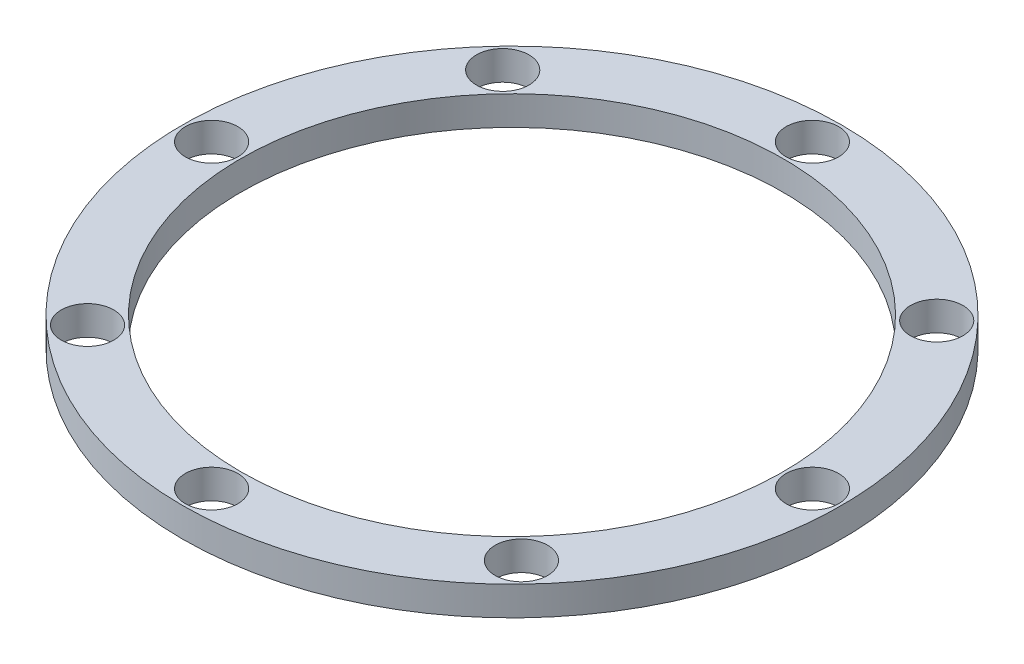
ISO-10303-21;
HEADER;
FILE_DESCRIPTION(('STEP AP214'),'2;1');
FILE_NAME('part.step','',(''),(''),'','','');
FILE_SCHEMA(('AUTOMOTIVE_DESIGN { 1 0 10303 214 1 1 1 1 }'));
ENDSEC;
DATA;
#1=APPLICATION_CONTEXT('core data for automotive mechanical design processes');
#2=APPLICATION_PROTOCOL_DEFINITION('international standard','automotive_design',2000,#1);
#3=PRODUCT_CONTEXT('',#1,'mechanical');
#4=PRODUCT('Part','Part','',(#3));
#5=PRODUCT_RELATED_PRODUCT_CATEGORY('part','',(#4));
#6=PRODUCT_DEFINITION_FORMATION('','',#4);
#7=PRODUCT_DEFINITION_CONTEXT('part definition',#1,'design');
#8=PRODUCT_DEFINITION('design','',#6,#7);
#9=PRODUCT_DEFINITION_SHAPE('','',#8);
#10=(LENGTH_UNIT() NAMED_UNIT(*) SI_UNIT(.MILLI.,.METRE.));
#11=(NAMED_UNIT(*) PLANE_ANGLE_UNIT() SI_UNIT($,.RADIAN.));
#12=(NAMED_UNIT(*) SI_UNIT($,.STERADIAN.) SOLID_ANGLE_UNIT());
#13=UNCERTAINTY_MEASURE_WITH_UNIT(LENGTH_MEASURE(1.E-05),#10,'distance_accuracy_value','');
#14=(GEOMETRIC_REPRESENTATION_CONTEXT(3) GLOBAL_UNCERTAINTY_ASSIGNED_CONTEXT((#13)) GLOBAL_UNIT_ASSIGNED_CONTEXT((#10,
#11,#12)) REPRESENTATION_CONTEXT('',''));
#15=CARTESIAN_POINT('',(0.,0.,0.));
#16=DIRECTION('',(0.,0.,1.));
#17=DIRECTION('',(1.,0.,0.));
#18=AXIS2_PLACEMENT_3D('',#15,#16,#17);
#19=CARTESIAN_POINT('',(0.,5.,51.5));
#20=DIRECTION('',(0.,-1.,0.));
#21=DIRECTION('',(0.,0.,-1.));
#22=AXIS2_PLACEMENT_3D('',#19,#20,#21);
#23=CYLINDRICAL_SURFACE('',#22,4.5);
#24=CARTESIAN_POINT('',(0.,5.,51.5));
#25=DIRECTION('',(0.,1.,0.));
#26=DIRECTION('',(0.,0.,1.));
#27=AXIS2_PLACEMENT_3D('',#24,#25,#26);
#28=CIRCLE('',#27,4.5);
#29=CARTESIAN_POINT('',(0.,5.,56.));
#30=VERTEX_POINT('',#29);
#31=EDGE_CURVE('E47',#30,#30,#28,.T.);
#32=ORIENTED_EDGE('',*,*,#31,.T.);
#33=EDGE_LOOP('',(#32));
#34=FACE_BOUND('',#33,.T.);
#35=CARTESIAN_POINT('',(0.,0.,51.5));
#36=DIRECTION('',(0.,1.,0.));
#37=DIRECTION('',(0.,0.,1.));
#38=AXIS2_PLACEMENT_3D('',#35,#36,#37);
#39=CIRCLE('',#38,4.5);
#40=CARTESIAN_POINT('',(0.,0.,56.));
#41=VERTEX_POINT('',#40);
#42=EDGE_CURVE('E79',#41,#41,#39,.T.);
#43=ORIENTED_EDGE('',*,*,#42,.F.);
#44=EDGE_LOOP('',(#43));
#45=FACE_BOUND('',#44,.T.);
#46=ADVANCED_FACE('F39',(#34,#45),#23,.F.);
#47=CARTESIAN_POINT('',(37.2149715697116,5.,35.5990995822304));
#48=DIRECTION('',(0.,-1.,0.));
#49=DIRECTION('',(0.,0.,-1.));
#50=AXIS2_PLACEMENT_3D('',#47,#48,#49);
#51=CYLINDRICAL_SURFACE('',#50,4.5);
#52=CARTESIAN_POINT('',(37.2149715697116,5.,35.5990995822304));
#53=DIRECTION('',(0.,1.,0.));
#54=DIRECTION('',(0.,0.,1.));
#55=AXIS2_PLACEMENT_3D('',#52,#53,#54);
#56=CIRCLE('',#55,4.5);
#57=CARTESIAN_POINT('',(37.2149715697116,5.,40.0990995822304));
#58=VERTEX_POINT('',#57);
#59=EDGE_CURVE('E52',#58,#58,#56,.T.);
#60=ORIENTED_EDGE('',*,*,#59,.T.);
#61=EDGE_LOOP('',(#60));
#62=FACE_BOUND('',#61,.T.);
#63=CARTESIAN_POINT('',(37.2149715697116,0.,35.5990995822304));
#64=DIRECTION('',(0.,1.,0.));
#65=DIRECTION('',(0.,0.,1.));
#66=AXIS2_PLACEMENT_3D('',#63,#64,#65);
#67=CIRCLE('',#66,4.5);
#68=CARTESIAN_POINT('',(37.2149715697116,0.,40.0990995822304));
#69=VERTEX_POINT('',#68);
#70=EDGE_CURVE('E77',#69,#69,#67,.T.);
#71=ORIENTED_EDGE('',*,*,#70,.F.);
#72=EDGE_LOOP('',(#71));
#73=FACE_BOUND('',#72,.T.);
#74=ADVANCED_FACE('F112',(#62,#73),#51,.F.);
#75=CARTESIAN_POINT('',(37.2149715697116,5.,-35.5990995822304));
#76=DIRECTION('',(0.,-1.,0.));
#77=DIRECTION('',(0.,0.,-1.));
#78=AXIS2_PLACEMENT_3D('',#75,#76,#77);
#79=CYLINDRICAL_SURFACE('',#78,4.50000000000001);
#80=CARTESIAN_POINT('',(37.2149715697116,5.,-35.5990995822304));
#81=DIRECTION('',(0.,1.,0.));
#82=DIRECTION('',(0.,0.,1.));
#83=AXIS2_PLACEMENT_3D('',#80,#81,#82);
#84=CIRCLE('',#83,4.50000000000001);
#85=CARTESIAN_POINT('',(37.2149715697116,5.,-31.0990995822304));
#86=VERTEX_POINT('',#85);
#87=EDGE_CURVE('E107',#86,#86,#84,.T.);
#88=ORIENTED_EDGE('',*,*,#87,.T.);
#89=EDGE_LOOP('',(#88));
#90=FACE_BOUND('',#89,.T.);
#91=CARTESIAN_POINT('',(37.2149715697116,0.,-35.5990995822304));
#92=DIRECTION('',(0.,1.,0.));
#93=DIRECTION('',(0.,0.,1.));
#94=AXIS2_PLACEMENT_3D('',#91,#92,#93);
#95=CIRCLE('',#94,4.50000000000001);
#96=CARTESIAN_POINT('',(37.2149715697116,0.,-31.0990995822304));
#97=VERTEX_POINT('',#96);
#98=EDGE_CURVE('E74',#97,#97,#95,.T.);
#99=ORIENTED_EDGE('',*,*,#98,.F.);
#100=EDGE_LOOP('',(#99));
#101=FACE_BOUND('',#100,.T.);
#102=ADVANCED_FACE('F131',(#90,#101),#79,.F.);
#103=CARTESIAN_POINT('',(-34.9219479720804,5.,37.8511234950207));
#104=DIRECTION('',(0.,-1.,0.));
#105=DIRECTION('',(0.,0.,-1.));
#106=AXIS2_PLACEMENT_3D('',#103,#104,#105);
#107=CYLINDRICAL_SURFACE('',#106,4.5);
#108=CARTESIAN_POINT('',(-34.9219479720804,5.,37.8511234950207));
#109=DIRECTION('',(0.,1.,0.));
#110=DIRECTION('',(0.,0.,1.));
#111=AXIS2_PLACEMENT_3D('',#108,#109,#110);
#112=CIRCLE('',#111,4.5);
#113=CARTESIAN_POINT('',(-34.9219479720804,5.,42.3511234950207));
#114=VERTEX_POINT('',#113);
#115=EDGE_CURVE('E104',#114,#114,#112,.T.);
#116=ORIENTED_EDGE('',*,*,#115,.T.);
#117=EDGE_LOOP('',(#116));
#118=FACE_BOUND('',#117,.T.);
#119=CARTESIAN_POINT('',(-34.9219479720804,0.,37.8511234950207));
#120=DIRECTION('',(0.,1.,0.));
#121=DIRECTION('',(0.,0.,1.));
#122=AXIS2_PLACEMENT_3D('',#119,#120,#121);
#123=CIRCLE('',#122,4.5);
#124=CARTESIAN_POINT('',(-34.9219479720804,0.,42.3511234950207));
#125=VERTEX_POINT('',#124);
#126=EDGE_CURVE('E71',#125,#125,#123,.T.);
#127=ORIENTED_EDGE('',*,*,#126,.F.);
#128=EDGE_LOOP('',(#127));
#129=FACE_BOUND('',#128,.T.);
#130=ADVANCED_FACE('F138',(#118,#129),#107,.F.);
#131=CARTESIAN_POINT('',(0.,5.,0.));
#132=DIRECTION('',(0.,-1.,0.));
#133=DIRECTION('',(0.,0.,-1.));
#134=AXIS2_PLACEMENT_3D('',#131,#132,#133);
#135=CYLINDRICAL_SURFACE('',#134,46.5);
#136=CARTESIAN_POINT('',(0.,5.,0.));
#137=DIRECTION('',(0.,1.,0.));
#138=DIRECTION('',(0.,0.,1.));
#139=AXIS2_PLACEMENT_3D('',#136,#137,#138);
#140=CIRCLE('',#139,46.5);
#141=CARTESIAN_POINT('',(0.,5.,46.5));
#142=VERTEX_POINT('',#141);
#143=EDGE_CURVE('E101',#142,#142,#140,.T.);
#144=ORIENTED_EDGE('',*,*,#143,.T.);
#145=EDGE_LOOP('',(#144));
#146=FACE_BOUND('',#145,.T.);
#147=CARTESIAN_POINT('',(0.,0.,0.));
#148=DIRECTION('',(0.,1.,0.));
#149=DIRECTION('',(0.,0.,1.));
#150=AXIS2_PLACEMENT_3D('',#147,#148,#149);
#151=CIRCLE('',#150,46.5);
#152=CARTESIAN_POINT('',(0.,0.,46.5));
#153=VERTEX_POINT('',#152);
#154=EDGE_CURVE('E68',#153,#153,#151,.T.);
#155=ORIENTED_EDGE('',*,*,#154,.F.);
#156=EDGE_LOOP('',(#155));
#157=FACE_BOUND('',#156,.T.);
#158=ADVANCED_FACE('F142',(#146,#157),#135,.F.);
#159=CARTESIAN_POINT('',(-51.5,5.,0.));
#160=DIRECTION('',(0.,-1.,0.));
#161=DIRECTION('',(0.,0.,-1.));
#162=AXIS2_PLACEMENT_3D('',#159,#160,#161);
#163=CYLINDRICAL_SURFACE('',#162,4.5);
#164=CARTESIAN_POINT('',(-51.5,5.,0.));
#165=DIRECTION('',(0.,1.,0.));
#166=DIRECTION('',(0.,0.,1.));
#167=AXIS2_PLACEMENT_3D('',#164,#165,#166);
#168=CIRCLE('',#167,4.5);
#169=CARTESIAN_POINT('',(-51.5,5.,4.5));
#170=VERTEX_POINT('',#169);
#171=EDGE_CURVE('E98',#170,#170,#168,.T.);
#172=ORIENTED_EDGE('',*,*,#171,.T.);
#173=EDGE_LOOP('',(#172));
#174=FACE_BOUND('',#173,.T.);
#175=CARTESIAN_POINT('',(-51.5,0.,0.));
#176=DIRECTION('',(0.,1.,0.));
#177=DIRECTION('',(0.,0.,1.));
#178=AXIS2_PLACEMENT_3D('',#175,#176,#177);
#179=CIRCLE('',#178,4.5);
#180=CARTESIAN_POINT('',(-51.5,0.,4.5));
#181=VERTEX_POINT('',#180);
#182=EDGE_CURVE('E65',#181,#181,#179,.T.);
#183=ORIENTED_EDGE('',*,*,#182,.F.);
#184=EDGE_LOOP('',(#183));
#185=FACE_BOUND('',#184,.T.);
#186=ADVANCED_FACE('F146',(#174,#185),#163,.F.);
#187=CARTESIAN_POINT('',(0.,5.,-51.5));
#188=DIRECTION('',(0.,-1.,0.));
#189=DIRECTION('',(0.,0.,-1.));
#190=AXIS2_PLACEMENT_3D('',#187,#188,#189);
#191=CYLINDRICAL_SURFACE('',#190,4.5);
#192=CARTESIAN_POINT('',(0.,5.,-51.5));
#193=DIRECTION('',(0.,1.,0.));
#194=DIRECTION('',(0.,0.,1.));
#195=AXIS2_PLACEMENT_3D('',#192,#193,#194);
#196=CIRCLE('',#195,4.5);
#197=CARTESIAN_POINT('',(0.,5.,-47.));
#198=VERTEX_POINT('',#197);
#199=EDGE_CURVE('E93',#198,#198,#196,.T.);
#200=ORIENTED_EDGE('',*,*,#199,.T.);
#201=EDGE_LOOP('',(#200));
#202=FACE_BOUND('',#201,.T.);
#203=CARTESIAN_POINT('',(0.,0.,-51.5));
#204=DIRECTION('',(0.,1.,0.));
#205=DIRECTION('',(0.,0.,1.));
#206=AXIS2_PLACEMENT_3D('',#203,#204,#205);
#207=CIRCLE('',#206,4.5);
#208=CARTESIAN_POINT('',(0.,0.,-47.));
#209=VERTEX_POINT('',#208);
#210=EDGE_CURVE('E62',#209,#209,#207,.T.);
#211=ORIENTED_EDGE('',*,*,#210,.F.);
#212=EDGE_LOOP('',(#211));
#213=FACE_BOUND('',#212,.T.);
#214=ADVANCED_FACE('F150',(#202,#213),#191,.F.);
#215=CARTESIAN_POINT('',(0.,5.,0.));
#216=DIRECTION('',(0.,-1.,0.));
#217=DIRECTION('',(0.,0.,-1.));
#218=AXIS2_PLACEMENT_3D('',#215,#216,#217);
#219=CYLINDRICAL_SURFACE('',#218,56.5);
#220=CARTESIAN_POINT('',(0.,5.,0.));
#221=DIRECTION('',(0.,1.,0.));
#222=DIRECTION('',(0.,0.,1.));
#223=AXIS2_PLACEMENT_3D('',#220,#221,#222);
#224=CIRCLE('',#223,56.5);
#225=CARTESIAN_POINT('',(0.,5.,56.5));
#226=VERTEX_POINT('',#225);
#227=EDGE_CURVE('E88',#226,#226,#224,.T.);
#228=ORIENTED_EDGE('',*,*,#227,.F.);
#229=EDGE_LOOP('',(#228));
#230=FACE_BOUND('',#229,.T.);
#231=CARTESIAN_POINT('',(0.,0.,0.));
#232=DIRECTION('',(0.,1.,0.));
#233=DIRECTION('',(0.,0.,1.));
#234=AXIS2_PLACEMENT_3D('',#231,#232,#233);
#235=CIRCLE('',#234,56.5);
#236=CARTESIAN_POINT('',(0.,0.,56.5));
#237=VERTEX_POINT('',#236);
#238=EDGE_CURVE('E59',#237,#237,#235,.T.);
#239=ORIENTED_EDGE('',*,*,#238,.T.);
#240=EDGE_LOOP('',(#239));
#241=FACE_BOUND('',#240,.T.);
#242=ADVANCED_FACE('F153',(#230,#241),#219,.T.);
#243=CARTESIAN_POINT('',(-37.2032320190572,5.,-35.6113679509254));
#244=DIRECTION('',(0.,-1.,0.));
#245=DIRECTION('',(0.,0.,-1.));
#246=AXIS2_PLACEMENT_3D('',#243,#244,#245);
#247=CYLINDRICAL_SURFACE('',#246,4.50000000000001);
#248=CARTESIAN_POINT('',(-37.2032320190572,5.,-35.6113679509254));
#249=DIRECTION('',(0.,1.,0.));
#250=DIRECTION('',(0.,0.,1.));
#251=AXIS2_PLACEMENT_3D('',#248,#249,#250);
#252=CIRCLE('',#251,4.50000000000001);
#253=CARTESIAN_POINT('',(-37.2032320190572,5.,-31.1113679509254));
#254=VERTEX_POINT('',#253);
#255=EDGE_CURVE('E84',#254,#254,#252,.T.);
#256=ORIENTED_EDGE('',*,*,#255,.T.);
#257=EDGE_LOOP('',(#256));
#258=FACE_BOUND('',#257,.T.);
#259=CARTESIAN_POINT('',(-37.2032320190572,0.,-35.6113679509254));
#260=DIRECTION('',(0.,1.,0.));
#261=DIRECTION('',(0.,0.,1.));
#262=AXIS2_PLACEMENT_3D('',#259,#260,#261);
#263=CIRCLE('',#262,4.50000000000001);
#264=CARTESIAN_POINT('',(-37.2032320190572,0.,-31.1113679509254));
#265=VERTEX_POINT('',#264);
#266=EDGE_CURVE('E56',#265,#265,#263,.T.);
#267=ORIENTED_EDGE('',*,*,#266,.F.);
#268=EDGE_LOOP('',(#267));
#269=FACE_BOUND('',#268,.T.);
#270=ADVANCED_FACE('F41',(#258,#269),#247,.F.);
#271=CARTESIAN_POINT('',(51.5,5.,0.));
#272=DIRECTION('',(0.,-1.,0.));
#273=DIRECTION('',(0.,0.,-1.));
#274=AXIS2_PLACEMENT_3D('',#271,#272,#273);
#275=CYLINDRICAL_SURFACE('',#274,4.5);
#276=CARTESIAN_POINT('',(51.5,5.,0.));
#277=DIRECTION('',(0.,1.,0.));
#278=DIRECTION('',(0.,0.,1.));
#279=AXIS2_PLACEMENT_3D('',#276,#277,#278);
#280=CIRCLE('',#279,4.5);
#281=CARTESIAN_POINT('',(51.5,5.,4.5));
#282=VERTEX_POINT('',#281);
#283=EDGE_CURVE('E10',#282,#282,#280,.T.);
#284=ORIENTED_EDGE('',*,*,#283,.T.);
#285=EDGE_LOOP('',(#284));
#286=FACE_BOUND('',#285,.T.);
#287=CARTESIAN_POINT('',(51.5,0.,0.));
#288=DIRECTION('',(0.,1.,0.));
#289=DIRECTION('',(0.,0.,1.));
#290=AXIS2_PLACEMENT_3D('',#287,#288,#289);
#291=CIRCLE('',#290,4.5);
#292=CARTESIAN_POINT('',(51.5,0.,4.5));
#293=VERTEX_POINT('',#292);
#294=EDGE_CURVE('E43',#293,#293,#291,.T.);
#295=ORIENTED_EDGE('',*,*,#294,.F.);
#296=EDGE_LOOP('',(#295));
#297=FACE_BOUND('',#296,.T.);
#298=ADVANCED_FACE('F119',(#286,#297),#275,.F.);
#299=CARTESIAN_POINT('',(0.,5.,0.));
#300=DIRECTION('',(0.,1.,0.));
#301=DIRECTION('',(0.,0.,1.));
#302=AXIS2_PLACEMENT_3D('',#299,#300,#301);
#303=PLANE('',#302);
#304=ORIENTED_EDGE('',*,*,#255,.F.);
#305=EDGE_LOOP('',(#304));
#306=FACE_BOUND('',#305,.T.);
#307=ORIENTED_EDGE('',*,*,#227,.T.);
#308=EDGE_LOOP('',(#307));
#309=FACE_BOUND('',#308,.T.);
#310=ORIENTED_EDGE('',*,*,#199,.F.);
#311=EDGE_LOOP('',(#310));
#312=FACE_BOUND('',#311,.T.);
#313=ORIENTED_EDGE('',*,*,#171,.F.);
#314=EDGE_LOOP('',(#313));
#315=FACE_BOUND('',#314,.T.);
#316=ORIENTED_EDGE('',*,*,#143,.F.);
#317=EDGE_LOOP('',(#316));
#318=FACE_BOUND('',#317,.T.);
#319=ORIENTED_EDGE('',*,*,#115,.F.);
#320=EDGE_LOOP('',(#319));
#321=FACE_BOUND('',#320,.T.);
#322=ORIENTED_EDGE('',*,*,#87,.F.);
#323=EDGE_LOOP('',(#322));
#324=FACE_BOUND('',#323,.T.);
#325=ORIENTED_EDGE('',*,*,#59,.F.);
#326=EDGE_LOOP('',(#325));
#327=FACE_BOUND('',#326,.T.);
#328=ORIENTED_EDGE('',*,*,#31,.F.);
#329=EDGE_LOOP('',(#328));
#330=FACE_BOUND('',#329,.T.);
#331=ORIENTED_EDGE('',*,*,#283,.F.);
#332=EDGE_LOOP('',(#331));
#333=FACE_BOUND('',#332,.T.);
#334=ADVANCED_FACE('F115',(#306,#309,#312,#315,#318,#321,#324,#327,#330,#333),#303,.T.);
#335=CARTESIAN_POINT('',(0.,0.,0.));
#336=DIRECTION('',(0.,1.,0.));
#337=DIRECTION('',(0.,0.,1.));
#338=AXIS2_PLACEMENT_3D('',#335,#336,#337);
#339=PLANE('',#338);
#340=ORIENTED_EDGE('',*,*,#266,.T.);
#341=EDGE_LOOP('',(#340));
#342=FACE_BOUND('',#341,.T.);
#343=ORIENTED_EDGE('',*,*,#238,.F.);
#344=EDGE_LOOP('',(#343));
#345=FACE_BOUND('',#344,.T.);
#346=ORIENTED_EDGE('',*,*,#210,.T.);
#347=EDGE_LOOP('',(#346));
#348=FACE_BOUND('',#347,.T.);
#349=ORIENTED_EDGE('',*,*,#182,.T.);
#350=EDGE_LOOP('',(#349));
#351=FACE_BOUND('',#350,.T.);
#352=ORIENTED_EDGE('',*,*,#154,.T.);
#353=EDGE_LOOP('',(#352));
#354=FACE_BOUND('',#353,.T.);
#355=ORIENTED_EDGE('',*,*,#126,.T.);
#356=EDGE_LOOP('',(#355));
#357=FACE_BOUND('',#356,.T.);
#358=ORIENTED_EDGE('',*,*,#98,.T.);
#359=EDGE_LOOP('',(#358));
#360=FACE_BOUND('',#359,.T.);
#361=ORIENTED_EDGE('',*,*,#70,.T.);
#362=EDGE_LOOP('',(#361));
#363=FACE_BOUND('',#362,.T.);
#364=ORIENTED_EDGE('',*,*,#42,.T.);
#365=EDGE_LOOP('',(#364));
#366=FACE_BOUND('',#365,.T.);
#367=ORIENTED_EDGE('',*,*,#294,.T.);
#368=EDGE_LOOP('',(#367));
#369=FACE_BOUND('',#368,.T.);
#370=ADVANCED_FACE('F118',(#342,#345,#348,#351,#354,#357,#360,#363,#366,#369),#339,.F.);
#371=CLOSED_SHELL('',(#46,#74,#102,#130,#158,#186,#214,#242,#270,#298,#334,#370));
#372=MANIFOLD_SOLID_BREP('B2',#371);
#373=ADVANCED_BREP_SHAPE_REPRESENTATION('',(#18,#372),#14);
#374=SHAPE_DEFINITION_REPRESENTATION(#9,#373);
ENDSEC;
END-ISO-10303-21;
